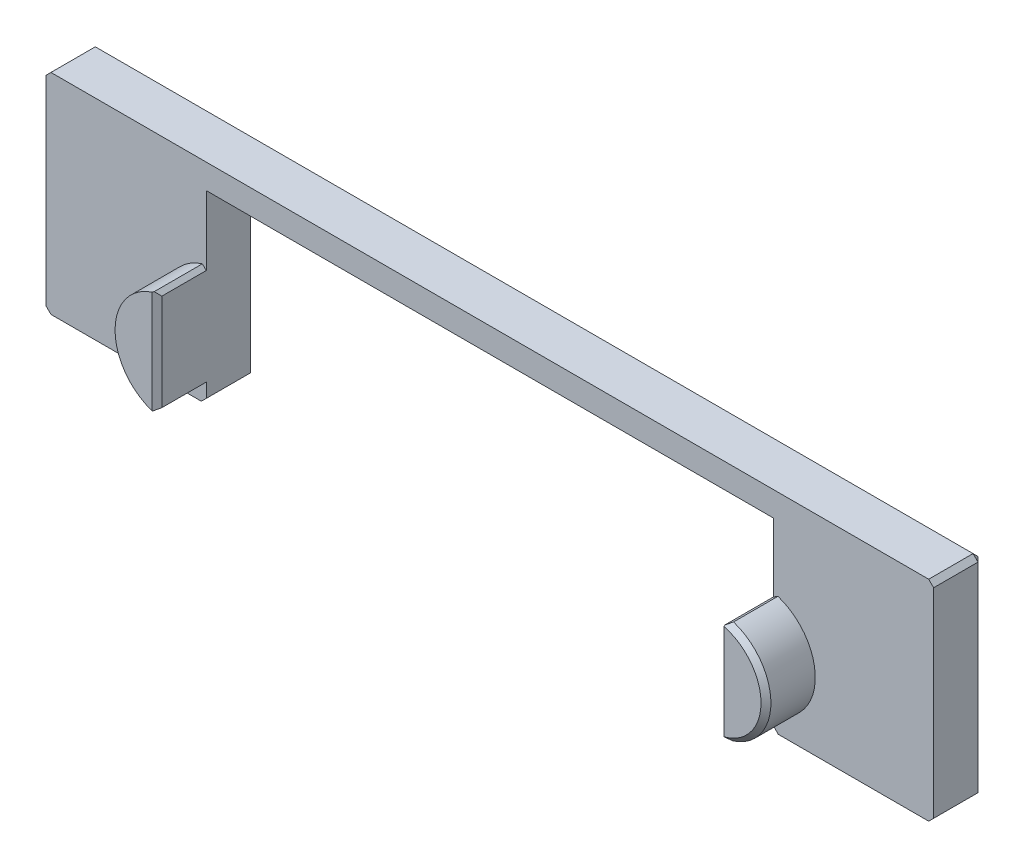
ISO-10303-21;
HEADER;
FILE_DESCRIPTION(('STEP AP214'),'2;1');
FILE_NAME('part.step','',(''),(''),'','','');
FILE_SCHEMA(('AUTOMOTIVE_DESIGN { 1 0 10303 214 1 1 1 1 }'));
ENDSEC;
DATA;
#1=APPLICATION_CONTEXT('core data for automotive mechanical design processes');
#2=APPLICATION_PROTOCOL_DEFINITION('international standard','automotive_design',2000,#1);
#3=PRODUCT_CONTEXT('',#1,'mechanical');
#4=PRODUCT('Part','Part','',(#3));
#5=PRODUCT_RELATED_PRODUCT_CATEGORY('part','',(#4));
#6=PRODUCT_DEFINITION_FORMATION('','',#4);
#7=PRODUCT_DEFINITION_CONTEXT('part definition',#1,'design');
#8=PRODUCT_DEFINITION('design','',#6,#7);
#9=PRODUCT_DEFINITION_SHAPE('','',#8);
#10=(LENGTH_UNIT() NAMED_UNIT(*) SI_UNIT(.MILLI.,.METRE.));
#11=(NAMED_UNIT(*) PLANE_ANGLE_UNIT() SI_UNIT($,.RADIAN.));
#12=(NAMED_UNIT(*) SI_UNIT($,.STERADIAN.) SOLID_ANGLE_UNIT());
#13=UNCERTAINTY_MEASURE_WITH_UNIT(LENGTH_MEASURE(1.E-05),#10,'distance_accuracy_value','');
#14=(GEOMETRIC_REPRESENTATION_CONTEXT(3) GLOBAL_UNCERTAINTY_ASSIGNED_CONTEXT((#13)) GLOBAL_UNIT_ASSIGNED_CONTEXT((#10,
#11,#12)) REPRESENTATION_CONTEXT('',''));
#15=CARTESIAN_POINT('',(0.,0.,0.));
#16=DIRECTION('',(0.,0.,1.));
#17=DIRECTION('',(1.,0.,0.));
#18=AXIS2_PLACEMENT_3D('',#15,#16,#17);
#19=CARTESIAN_POINT('',(-18.,-4.25000000000001,-2.));
#20=DIRECTION('',(-1.,0.,0.));
#21=DIRECTION('',(0.,0.,1.));
#22=AXIS2_PLACEMENT_3D('',#19,#20,#21);
#23=PLANE('',#22);
#24=DIRECTION('',(0.,-1.,0.));
#25=VECTOR('',#24,1.);
#26=CARTESIAN_POINT('',(-18.,-4.25000000000001,-1.8));
#27=LINE('',#26,#25);
#28=CARTESIAN_POINT('',(-18.,4.05000000000002,-1.8));
#29=VERTEX_POINT('',#28);
#30=CARTESIAN_POINT('',(-18.,-4.05000000000001,-1.8));
#31=VERTEX_POINT('',#30);
#32=EDGE_CURVE('E589',#29,#31,#27,.T.);
#33=ORIENTED_EDGE('',*,*,#32,.T.);
#34=DIRECTION('',(0.,0.,1.));
#35=VECTOR('',#34,1.);
#36=CARTESIAN_POINT('',(-18.,-4.05000000000001,-2.));
#37=LINE('',#36,#35);
#38=CARTESIAN_POINT('',(-18.,-4.05000000000001,0.));
#39=VERTEX_POINT('',#38);
#40=EDGE_CURVE('E591',#31,#39,#37,.T.);
#41=ORIENTED_EDGE('',*,*,#40,.T.);
#42=DIRECTION('',(0.,-1.,0.));
#43=VECTOR('',#42,1.);
#44=CARTESIAN_POINT('',(-18.,-4.25000000000001,0.));
#45=LINE('',#44,#43);
#46=CARTESIAN_POINT('',(-18.,4.05000000000002,0.));
#47=VERTEX_POINT('',#46);
#48=EDGE_CURVE('E558',#47,#39,#45,.T.);
#49=ORIENTED_EDGE('',*,*,#48,.F.);
#50=DIRECTION('',(0.,0.,-1.));
#51=VECTOR('',#50,1.);
#52=CARTESIAN_POINT('',(-18.,4.05000000000002,-2.));
#53=LINE('',#52,#51);
#54=EDGE_CURVE('E587',#47,#29,#53,.T.);
#55=ORIENTED_EDGE('',*,*,#54,.T.);
#56=EDGE_LOOP('',(#33,#41,#49,#55));
#57=FACE_BOUND('',#56,.T.);
#58=ADVANCED_FACE('F41',(#57),#23,.T.);
#59=CARTESIAN_POINT('',(-18.,4.25000000000001,-2.));
#60=DIRECTION('',(0.,1.,0.));
#61=DIRECTION('',(0.,0.,1.));
#62=AXIS2_PLACEMENT_3D('',#59,#60,#61);
#63=PLANE('',#62);
#64=DIRECTION('',(-1.,0.,0.));
#65=VECTOR('',#64,1.);
#66=CARTESIAN_POINT('',(-18.,4.25000000000001,-1.8));
#67=LINE('',#66,#65);
#68=CARTESIAN_POINT('',(17.8,4.25000000000001,-1.8));
#69=VERTEX_POINT('',#68);
#70=CARTESIAN_POINT('',(-17.8,4.25000000000001,-1.8));
#71=VERTEX_POINT('',#70);
#72=EDGE_CURVE('E595',#69,#71,#67,.T.);
#73=ORIENTED_EDGE('',*,*,#72,.T.);
#74=DIRECTION('',(0.,0.,1.));
#75=VECTOR('',#74,1.);
#76=CARTESIAN_POINT('',(-17.8,4.25000000000001,-2.));
#77=LINE('',#76,#75);
#78=CARTESIAN_POINT('',(-17.8,4.25000000000001,0.));
#79=VERTEX_POINT('',#78);
#80=EDGE_CURVE('E597',#71,#79,#77,.T.);
#81=ORIENTED_EDGE('',*,*,#80,.T.);
#82=DIRECTION('',(-1.,0.,0.));
#83=VECTOR('',#82,1.);
#84=CARTESIAN_POINT('',(-18.,4.25000000000001,0.));
#85=LINE('',#84,#83);
#86=CARTESIAN_POINT('',(17.8,4.25000000000001,0.));
#87=VERTEX_POINT('',#86);
#88=EDGE_CURVE('E239',#87,#79,#85,.T.);
#89=ORIENTED_EDGE('',*,*,#88,.F.);
#90=DIRECTION('',(0.,0.,-1.));
#91=VECTOR('',#90,1.);
#92=CARTESIAN_POINT('',(17.8,4.25000000000001,-2.));
#93=LINE('',#92,#91);
#94=EDGE_CURVE('E593',#87,#69,#93,.T.);
#95=ORIENTED_EDGE('',*,*,#94,.T.);
#96=EDGE_LOOP('',(#73,#81,#89,#95));
#97=FACE_BOUND('',#96,.T.);
#98=ADVANCED_FACE('F506',(#97),#63,.T.);
#99=CARTESIAN_POINT('',(18.,4.25000000000001,-2.));
#100=DIRECTION('',(1.,0.,0.));
#101=DIRECTION('',(0.,0.,-1.));
#102=AXIS2_PLACEMENT_3D('',#99,#100,#101);
#103=PLANE('',#102);
#104=DIRECTION('',(0.,1.,0.));
#105=VECTOR('',#104,1.);
#106=CARTESIAN_POINT('',(18.,4.25000000000001,-1.8));
#107=LINE('',#106,#105);
#108=CARTESIAN_POINT('',(18.,-4.04999999999999,-1.8));
#109=VERTEX_POINT('',#108);
#110=CARTESIAN_POINT('',(18.,4.05000000000002,-1.8));
#111=VERTEX_POINT('',#110);
#112=EDGE_CURVE('E59',#109,#111,#107,.T.);
#113=ORIENTED_EDGE('',*,*,#112,.T.);
#114=DIRECTION('',(0.,0.,1.));
#115=VECTOR('',#114,1.);
#116=CARTESIAN_POINT('',(18.,4.05000000000002,-2.));
#117=LINE('',#116,#115);
#118=CARTESIAN_POINT('',(18.,4.05000000000002,0.));
#119=VERTEX_POINT('',#118);
#120=EDGE_CURVE('E601',#111,#119,#117,.T.);
#121=ORIENTED_EDGE('',*,*,#120,.T.);
#122=DIRECTION('',(0.,1.,0.));
#123=VECTOR('',#122,1.);
#124=CARTESIAN_POINT('',(18.,4.25000000000001,0.));
#125=LINE('',#124,#123);
#126=CARTESIAN_POINT('',(18.,-4.04999999999999,0.));
#127=VERTEX_POINT('',#126);
#128=EDGE_CURVE('E265',#127,#119,#125,.T.);
#129=ORIENTED_EDGE('',*,*,#128,.F.);
#130=DIRECTION('',(0.,0.,-1.));
#131=VECTOR('',#130,1.);
#132=CARTESIAN_POINT('',(18.,-4.04999999999999,-2.));
#133=LINE('',#132,#131);
#134=EDGE_CURVE('E64',#127,#109,#133,.T.);
#135=ORIENTED_EDGE('',*,*,#134,.T.);
#136=EDGE_LOOP('',(#113,#121,#129,#135));
#137=FACE_BOUND('',#136,.T.);
#138=ADVANCED_FACE('F512',(#137),#103,.T.);
#139=CARTESIAN_POINT('',(18.,-4.24999999999999,-2.));
#140=DIRECTION('',(0.,-1.,0.));
#141=DIRECTION('',(1.,0.,0.));
#142=AXIS2_PLACEMENT_3D('',#139,#140,#141);
#143=PLANE('',#142);
#144=DIRECTION('',(1.,0.,0.));
#145=VECTOR('',#144,1.);
#146=CARTESIAN_POINT('',(18.,-4.24999999999999,0.));
#147=LINE('',#146,#145);
#148=CARTESIAN_POINT('',(11.7,-4.25000000000001,0.));
#149=VERTEX_POINT('',#148);
#150=CARTESIAN_POINT('',(17.8,-4.24999999999999,0.));
#151=VERTEX_POINT('',#150);
#152=EDGE_CURVE('E262',#149,#151,#147,.T.);
#153=ORIENTED_EDGE('',*,*,#152,.F.);
#154=DIRECTION('',(0.,0.,-1.));
#155=VECTOR('',#154,1.);
#156=CARTESIAN_POINT('',(11.7,-4.25000000000001,-2.));
#157=LINE('',#156,#155);
#158=CARTESIAN_POINT('',(11.7,-4.25000000000001,-1.8));
#159=VERTEX_POINT('',#158);
#160=EDGE_CURVE('E585',#149,#159,#157,.T.);
#161=ORIENTED_EDGE('',*,*,#160,.T.);
#162=DIRECTION('',(1.,0.,0.));
#163=VECTOR('',#162,1.);
#164=CARTESIAN_POINT('',(18.,-4.24999999999999,-1.8));
#165=LINE('',#164,#163);
#166=CARTESIAN_POINT('',(17.8,-4.24999999999999,-1.8));
#167=VERTEX_POINT('',#166);
#168=EDGE_CURVE('E583',#159,#167,#165,.T.);
#169=ORIENTED_EDGE('',*,*,#168,.T.);
#170=DIRECTION('',(0.,0.,1.));
#171=VECTOR('',#170,1.);
#172=CARTESIAN_POINT('',(17.8,-4.24999999999999,-2.));
#173=LINE('',#172,#171);
#174=EDGE_CURVE('E577',#167,#151,#173,.T.);
#175=ORIENTED_EDGE('',*,*,#174,.T.);
#176=EDGE_LOOP('',(#153,#161,#169,#175));
#177=FACE_BOUND('',#176,.T.);
#178=ADVANCED_FACE('F768',(#177),#143,.T.);
#179=CARTESIAN_POINT('',(11.5,-4.25000000000001,-2.));
#180=DIRECTION('',(-1.,0.,0.));
#181=DIRECTION('',(0.,0.,1.));
#182=AXIS2_PLACEMENT_3D('',#179,#180,#181);
#183=PLANE('',#182);
#184=DIRECTION('',(0.,-1.,0.));
#185=VECTOR('',#184,1.);
#186=CARTESIAN_POINT('',(11.5,-4.25000000000001,0.));
#187=LINE('',#186,#185);
#188=CARTESIAN_POINT('',(11.5,-3.44242852856285,0.));
#189=VERTEX_POINT('',#188);
#190=CARTESIAN_POINT('',(11.5,-4.05000000000001,0.));
#191=VERTEX_POINT('',#190);
#192=EDGE_CURVE('E255',#189,#191,#187,.T.);
#193=ORIENTED_EDGE('',*,*,#192,.F.);
#194=DIRECTION('',(0.,0.,1.));
#195=VECTOR('',#194,1.);
#196=CARTESIAN_POINT('',(11.5,-3.44242852856285,2.));
#197=LINE('',#196,#195);
#198=CARTESIAN_POINT('',(11.5,-3.44242852856285,1.99425111527518));
#199=VERTEX_POINT('',#198);
#200=EDGE_CURVE('E678',#189,#199,#197,.T.);
#201=ORIENTED_EDGE('',*,*,#200,.T.);
#202=CARTESIAN_POINT('',(11.5,-3.44242852856285,1.99425111527518));
#203=CARTESIAN_POINT('',(11.5,-3.4414390983257,1.99520930989538));
#204=CARTESIAN_POINT('',(11.5,-3.44044964525219,1.99616748093255));
#205=CARTESIAN_POINT('',(11.5,-3.43847069343248,1.99808377584082));
#206=CARTESIAN_POINT('',(11.5,-3.43748119468627,1.99904189971193));
#207=CARTESIAN_POINT('',(11.5,-3.4364916731037,2.));
#208=B_SPLINE_CURVE_WITH_KNOTS('',3,(#202,#203,#204,#205,#206,#207),.UNSPECIFIED.,.F.,.F.,(4,2,
4),(0.,0.00413206753214065,0.0082641350642888),.UNSPECIFIED.);
#209=CARTESIAN_POINT('',(11.5,-3.4364916731037,2.));
#210=VERTEX_POINT('',#209);
#211=EDGE_CURVE('E312',#199,#210,#208,.T.);
#212=ORIENTED_EDGE('',*,*,#211,.T.);
#213=DIRECTION('',(0.,-1.,0.));
#214=VECTOR('',#213,1.);
#215=CARTESIAN_POINT('',(11.5,0.,2.));
#216=LINE('',#215,#214);
#217=CARTESIAN_POINT('',(11.5,0.436491673103699,2.));
#218=VERTEX_POINT('',#217);
#219=EDGE_CURVE('E552',#218,#210,#216,.T.);
#220=ORIENTED_EDGE('',*,*,#219,.F.);
#221=CARTESIAN_POINT('',(11.5,0.436491673103699,2.));
#222=CARTESIAN_POINT('',(11.5,0.443064199806818,1.99363613963068));
#223=CARTESIAN_POINT('',(11.5,0.449635743499461,1.98727126464591));
#224=CARTESIAN_POINT('',(11.5,0.462776864860829,1.97453948544832));
#225=CARTESIAN_POINT('',(11.5,0.469346442529555,1.9681725812355));
#226=CARTESIAN_POINT('',(11.5,0.475915037187806,1.96180466240723));
#227=B_SPLINE_CURVE_WITH_KNOTS('',3,(#221,#222,#223,#224,#225,#226),.UNSPECIFIED.,.F.,.F.,(4,2,
4),(0.,0.027445789853547,0.054891579694714),.UNSPECIFIED.);
#228=CARTESIAN_POINT('',(11.5,0.475915037187806,1.96180466240723));
#229=VERTEX_POINT('',#228);
#230=EDGE_CURVE('E304',#218,#229,#227,.T.);
#231=ORIENTED_EDGE('',*,*,#230,.T.);
#232=DIRECTION('',(0.,0.,-1.));
#233=VECTOR('',#232,1.);
#234=CARTESIAN_POINT('',(11.5,0.475915037187806,0.));
#235=LINE('',#234,#233);
#236=CARTESIAN_POINT('',(11.5,0.475915037187806,0.));
#237=VERTEX_POINT('',#236);
#238=EDGE_CURVE('E301',#229,#237,#235,.T.);
#239=ORIENTED_EDGE('',*,*,#238,.T.);
#240=CARTESIAN_POINT('',(11.5,3.25,0.));
#241=VERTEX_POINT('',#240);
#242=EDGE_CURVE('E258',#241,#237,#187,.T.);
#243=ORIENTED_EDGE('',*,*,#242,.F.);
#244=DIRECTION('',(0.,0.,1.));
#245=VECTOR('',#244,1.);
#246=CARTESIAN_POINT('',(11.5,3.25,-2.));
#247=LINE('',#246,#245);
#248=CARTESIAN_POINT('',(11.5,3.25,-1.8));
#249=VERTEX_POINT('',#248);
#250=EDGE_CURVE('E238',#249,#241,#247,.T.);
#251=ORIENTED_EDGE('',*,*,#250,.F.);
#252=DIRECTION('',(0.,-1.,0.));
#253=VECTOR('',#252,1.);
#254=CARTESIAN_POINT('',(11.5,-4.25000000000001,-1.8));
#255=LINE('',#254,#253);
#256=CARTESIAN_POINT('',(11.5,-4.05000000000001,-1.8));
#257=VERTEX_POINT('',#256);
#258=EDGE_CURVE('E299',#249,#257,#255,.T.);
#259=ORIENTED_EDGE('',*,*,#258,.T.);
#260=DIRECTION('',(0.,0.,1.));
#261=VECTOR('',#260,1.);
#262=CARTESIAN_POINT('',(11.5,-4.05000000000001,-2.));
#263=LINE('',#262,#261);
#264=EDGE_CURVE('E297',#257,#191,#263,.T.);
#265=ORIENTED_EDGE('',*,*,#264,.T.);
#266=EDGE_LOOP('',(#193,#201,#212,#220,#231,#239,#243,#251,#259,#265));
#267=FACE_BOUND('',#266,.T.);
#268=ADVANCED_FACE('F318',(#267),#183,.T.);
#269=CARTESIAN_POINT('',(11.5,3.25,-2.));
#270=DIRECTION('',(0.,-1.,0.));
#271=DIRECTION('',(0.,0.,-1.));
#272=AXIS2_PLACEMENT_3D('',#269,#270,#271);
#273=PLANE('',#272);
#274=DIRECTION('',(0.,0.,1.));
#275=VECTOR('',#274,1.);
#276=CARTESIAN_POINT('',(-11.5,3.25,-2.));
#277=LINE('',#276,#275);
#278=CARTESIAN_POINT('',(-11.5,3.25,-1.8));
#279=VERTEX_POINT('',#278);
#280=CARTESIAN_POINT('',(-11.5,3.25,0.));
#281=VERTEX_POINT('',#280);
#282=EDGE_CURVE('E228',#279,#281,#277,.T.);
#283=ORIENTED_EDGE('',*,*,#282,.F.);
#284=DIRECTION('',(1.,0.,0.));
#285=VECTOR('',#284,1.);
#286=CARTESIAN_POINT('',(11.5,3.25,-1.8));
#287=LINE('',#286,#285);
#288=EDGE_CURVE('E574',#279,#249,#287,.T.);
#289=ORIENTED_EDGE('',*,*,#288,.T.);
#290=ORIENTED_EDGE('',*,*,#250,.T.);
#291=DIRECTION('',(1.,0.,0.));
#292=VECTOR('',#291,1.);
#293=CARTESIAN_POINT('',(11.5,3.25,0.));
#294=LINE('',#293,#292);
#295=EDGE_CURVE('E245',#281,#241,#294,.T.);
#296=ORIENTED_EDGE('',*,*,#295,.F.);
#297=EDGE_LOOP('',(#283,#289,#290,#296));
#298=FACE_BOUND('',#297,.T.);
#299=ADVANCED_FACE('F252',(#298),#273,.T.);
#300=CARTESIAN_POINT('',(-11.5,3.25,-2.));
#301=DIRECTION('',(1.,0.,0.));
#302=DIRECTION('',(0.,1.,0.));
#303=AXIS2_PLACEMENT_3D('',#300,#301,#302);
#304=PLANE('',#303);
#305=DIRECTION('',(0.,0.,-1.));
#306=VECTOR('',#305,1.);
#307=CARTESIAN_POINT('',(-11.5,-3.47591503718783,-2.));
#308=LINE('',#307,#306);
#309=CARTESIAN_POINT('',(-11.5,-3.47591503718783,1.80000000000004));
#310=VERTEX_POINT('',#309);
#311=CARTESIAN_POINT('',(-11.5,-3.47591503718783,0.));
#312=VERTEX_POINT('',#311);
#313=EDGE_CURVE('E278',#310,#312,#308,.T.);
#314=ORIENTED_EDGE('',*,*,#313,.T.);
#315=DIRECTION('',(0.,1.,0.));
#316=VECTOR('',#315,1.);
#317=CARTESIAN_POINT('',(-11.5,3.25,0.));
#318=LINE('',#317,#316);
#319=CARTESIAN_POINT('',(-11.5,-4.05000000000001,0.));
#320=VERTEX_POINT('',#319);
#321=EDGE_CURVE('E249',#320,#312,#318,.T.);
#322=ORIENTED_EDGE('',*,*,#321,.F.);
#323=DIRECTION('',(0.,0.,-1.));
#324=VECTOR('',#323,1.);
#325=CARTESIAN_POINT('',(-11.5,-4.05000000000001,-2.));
#326=LINE('',#325,#324);
#327=CARTESIAN_POINT('',(-11.5,-4.05000000000001,-1.8));
#328=VERTEX_POINT('',#327);
#329=EDGE_CURVE('E272',#320,#328,#326,.T.);
#330=ORIENTED_EDGE('',*,*,#329,.T.);
#331=DIRECTION('',(0.,1.,0.));
#332=VECTOR('',#331,1.);
#333=CARTESIAN_POINT('',(-11.5,3.25,-1.8));
#334=LINE('',#333,#332);
#335=EDGE_CURVE('E234',#328,#279,#334,.T.);
#336=ORIENTED_EDGE('',*,*,#335,.T.);
#337=ORIENTED_EDGE('',*,*,#282,.T.);
#338=CARTESIAN_POINT('',(-11.5,0.442428528562881,0.));
#339=VERTEX_POINT('',#338);
#340=EDGE_CURVE('E232',#339,#281,#318,.T.);
#341=ORIENTED_EDGE('',*,*,#340,.F.);
#342=DIRECTION('',(0.,0.,1.));
#343=VECTOR('',#342,1.);
#344=CARTESIAN_POINT('',(-11.5,0.442428528562881,-2.));
#345=LINE('',#344,#343);
#346=CARTESIAN_POINT('',(-11.5,0.442428528562881,1.80000000000004));
#347=VERTEX_POINT('',#346);
#348=EDGE_CURVE('E274',#339,#347,#345,.T.);
#349=ORIENTED_EDGE('',*,*,#348,.T.);
#350=DIRECTION('',(0.,-1.,0.));
#351=VECTOR('',#350,1.);
#352=CARTESIAN_POINT('',(-11.5,3.25,1.80000000000004));
#353=LINE('',#352,#351);
#354=EDGE_CURVE('E276',#347,#310,#353,.T.);
#355=ORIENTED_EDGE('',*,*,#354,.T.);
#356=EDGE_LOOP('',(#314,#322,#330,#336,#337,#341,#349,#355));
#357=FACE_BOUND('',#356,.T.);
#358=ADVANCED_FACE('F231',(#357),#304,.T.);
#359=CARTESIAN_POINT('',(-11.5,-4.25000000000001,-2.));
#360=DIRECTION('',(0.,-1.,0.));
#361=DIRECTION('',(1.,0.,0.));
#362=AXIS2_PLACEMENT_3D('',#359,#360,#361);
#363=PLANE('',#362);
#364=DIRECTION('',(1.,0.,0.));
#365=VECTOR('',#364,1.);
#366=CARTESIAN_POINT('',(-11.5,-4.25000000000001,-1.8));
#367=LINE('',#366,#365);
#368=CARTESIAN_POINT('',(-17.8,-4.25000000000001,-1.8));
#369=VERTEX_POINT('',#368);
#370=CARTESIAN_POINT('',(-11.7000000000001,-4.25000000000001,-1.8));
#371=VERTEX_POINT('',#370);
#372=EDGE_CURVE('E690',#369,#371,#367,.T.);
#373=ORIENTED_EDGE('',*,*,#372,.T.);
#374=DIRECTION('',(0.,0.,1.));
#375=VECTOR('',#374,1.);
#376=CARTESIAN_POINT('',(-11.7000000000001,-4.25000000000001,-2.));
#377=LINE('',#376,#375);
#378=CARTESIAN_POINT('',(-11.7000000000001,-4.25000000000001,0.));
#379=VERTEX_POINT('',#378);
#380=EDGE_CURVE('E572',#371,#379,#377,.T.);
#381=ORIENTED_EDGE('',*,*,#380,.T.);
#382=DIRECTION('',(1.,0.,0.));
#383=VECTOR('',#382,1.);
#384=CARTESIAN_POINT('',(-11.5,-4.25000000000001,0.));
#385=LINE('',#384,#383);
#386=CARTESIAN_POINT('',(-17.8,-4.25000000000001,0.));
#387=VERTEX_POINT('',#386);
#388=EDGE_CURVE('E250',#387,#379,#385,.T.);
#389=ORIENTED_EDGE('',*,*,#388,.F.);
#390=DIRECTION('',(0.,0.,-1.));
#391=VECTOR('',#390,1.);
#392=CARTESIAN_POINT('',(-17.8,-4.25000000000001,-2.));
#393=LINE('',#392,#391);
#394=EDGE_CURVE('E686',#387,#369,#393,.T.);
#395=ORIENTED_EDGE('',*,*,#394,.T.);
#396=EDGE_LOOP('',(#373,#381,#389,#395));
#397=FACE_BOUND('',#396,.T.);
#398=ADVANCED_FACE('F517',(#397),#363,.T.);
#399=CARTESIAN_POINT('',(0.,0.,-2.));
#400=DIRECTION('',(0.,0.,-1.));
#401=DIRECTION('',(-1.,0.,0.));
#402=AXIS2_PLACEMENT_3D('',#399,#400,#401);
#403=PLANE('',#402);
#404=DIRECTION('',(0.,-1.,0.));
#405=VECTOR('',#404,1.);
#406=CARTESIAN_POINT('',(-11.7,0.,-2.));
#407=LINE('',#406,#405);
#408=CARTESIAN_POINT('',(-11.7,3.45,-2.));
#409=VERTEX_POINT('',#408);
#410=CARTESIAN_POINT('',(-11.7,-4.05000000000001,-2.));
#411=VERTEX_POINT('',#410);
#412=EDGE_CURVE('E705',#409,#411,#407,.T.);
#413=ORIENTED_EDGE('',*,*,#412,.T.);
#414=DIRECTION('',(-1.,0.,0.));
#415=VECTOR('',#414,1.);
#416=CARTESIAN_POINT('',(0.,-4.05000000000001,-2.));
#417=LINE('',#416,#415);
#418=CARTESIAN_POINT('',(-17.8,-4.05000000000001,-2.));
#419=VERTEX_POINT('',#418);
#420=EDGE_CURVE('E707',#411,#419,#417,.T.);
#421=ORIENTED_EDGE('',*,*,#420,.T.);
#422=DIRECTION('',(0.,1.,0.));
#423=VECTOR('',#422,1.);
#424=CARTESIAN_POINT('',(-17.8,0.,-2.));
#425=LINE('',#424,#423);
#426=CARTESIAN_POINT('',(-17.8,4.05000000000002,-2.));
#427=VERTEX_POINT('',#426);
#428=EDGE_CURVE('E697',#419,#427,#425,.T.);
#429=ORIENTED_EDGE('',*,*,#428,.T.);
#430=DIRECTION('',(1.,0.,0.));
#431=VECTOR('',#430,1.);
#432=CARTESIAN_POINT('',(0.,4.05000000000002,-2.));
#433=LINE('',#432,#431);
#434=CARTESIAN_POINT('',(17.8,4.05000000000002,-2.));
#435=VERTEX_POINT('',#434);
#436=EDGE_CURVE('E695',#427,#435,#433,.T.);
#437=ORIENTED_EDGE('',*,*,#436,.T.);
#438=DIRECTION('',(0.,-1.,0.));
#439=VECTOR('',#438,1.);
#440=CARTESIAN_POINT('',(17.8,0.,-2.));
#441=LINE('',#440,#439);
#442=CARTESIAN_POINT('',(17.8,-4.05,-2.));
#443=VERTEX_POINT('',#442);
#444=EDGE_CURVE('E693',#435,#443,#441,.T.);
#445=ORIENTED_EDGE('',*,*,#444,.T.);
#446=DIRECTION('',(-1.,0.,0.));
#447=VECTOR('',#446,1.);
#448=CARTESIAN_POINT('',(0.,-4.05000000000004,-2.));
#449=LINE('',#448,#447);
#450=CARTESIAN_POINT('',(11.7,-4.05000000000001,-2.));
#451=VERTEX_POINT('',#450);
#452=EDGE_CURVE('E699',#443,#451,#449,.T.);
#453=ORIENTED_EDGE('',*,*,#452,.T.);
#454=DIRECTION('',(0.,1.,0.));
#455=VECTOR('',#454,1.);
#456=CARTESIAN_POINT('',(11.7,0.,-2.));
#457=LINE('',#456,#455);
#458=CARTESIAN_POINT('',(11.7,3.45,-2.));
#459=VERTEX_POINT('',#458);
#460=EDGE_CURVE('E701',#451,#459,#457,.T.);
#461=ORIENTED_EDGE('',*,*,#460,.T.);
#462=DIRECTION('',(-1.,0.,0.));
#463=VECTOR('',#462,1.);
#464=CARTESIAN_POINT('',(0.,3.45,-2.));
#465=LINE('',#464,#463);
#466=EDGE_CURVE('E703',#459,#409,#465,.T.);
#467=ORIENTED_EDGE('',*,*,#466,.T.);
#468=EDGE_LOOP('',(#413,#421,#429,#437,#445,#453,#461,#467));
#469=FACE_BOUND('',#468,.T.);
#470=ADVANCED_FACE('F731',(#469),#403,.T.);
#471=CARTESIAN_POINT('',(0.,0.,0.));
#472=DIRECTION('',(0.,0.,-1.));
#473=DIRECTION('',(-1.,0.,0.));
#474=AXIS2_PLACEMENT_3D('',#471,#472,#473);
#475=PLANE('',#474);
#476=ORIENTED_EDGE('',*,*,#388,.T.);
#477=DIRECTION('',(-0.707106781186554,-0.707106781186541,0.));
#478=VECTOR('',#477,1.);
#479=CARTESIAN_POINT('',(-11.7000000000001,-4.25000000000001,0.));
#480=LINE('',#479,#478);
#481=EDGE_CURVE('E563',#379,#320,#480,.F.);
#482=ORIENTED_EDGE('',*,*,#481,.T.);
#483=ORIENTED_EDGE('',*,*,#321,.T.);
#484=DIRECTION('',(0.849308696067092,0.52789652280046,0.));
#485=VECTOR('',#484,1.);
#486=CARTESIAN_POINT('',(-1.64634304340196,2.64872641337585,0.));
#487=LINE('',#486,#485);
#488=CARTESIAN_POINT('',(-11.6847220332705,-3.59073090979063,0.));
#489=VERTEX_POINT('',#488);
#490=EDGE_CURVE('E603',#312,#489,#487,.F.);
#491=ORIENTED_EDGE('',*,*,#490,.T.);
#492=CARTESIAN_POINT('',(-11.,-1.5,0.));
#493=DIRECTION('',(0.,0.,-1.));
#494=DIRECTION('',(-1.,0.,0.));
#495=AXIS2_PLACEMENT_3D('',#492,#493,#494);
#496=CIRCLE('',#495,2.2);
#497=CARTESIAN_POINT('',(-11.6571361936925,0.599564722255368,0.));
#498=VERTEX_POINT('',#497);
#499=EDGE_CURVE('E549',#489,#498,#496,.T.);
#500=ORIENTED_EDGE('',*,*,#499,.T.);
#501=DIRECTION('',(-0.707106781186552,0.707106781186543,0.));
#502=VECTOR('',#501,1.);
#503=CARTESIAN_POINT('',(-5.52878573571851,-5.52878573571858,0.));
#504=LINE('',#503,#502);
#505=EDGE_CURVE('E11',#498,#339,#504,.F.);
#506=ORIENTED_EDGE('',*,*,#505,.T.);
#507=ORIENTED_EDGE('',*,*,#340,.T.);
#508=ORIENTED_EDGE('',*,*,#295,.T.);
#509=ORIENTED_EDGE('',*,*,#242,.T.);
#510=DIRECTION('',(-0.849308696067093,-0.527896522800458,0.));
#511=VECTOR('',#510,1.);
#512=CARTESIAN_POINT('',(2.99138436571596,-4.81270219702138,0.));
#513=LINE('',#512,#511);
#514=CARTESIAN_POINT('',(11.6847220332705,0.590730909790623,0.));
#515=VERTEX_POINT('',#514);
#516=EDGE_CURVE('E51',#237,#515,#513,.F.);
#517=ORIENTED_EDGE('',*,*,#516,.T.);
#518=CARTESIAN_POINT('',(11.,-1.5,0.));
#519=DIRECTION('',(0.,0.,1.));
#520=DIRECTION('',(1.,0.,0.));
#521=AXIS2_PLACEMENT_3D('',#518,#519,#520);
#522=CIRCLE('',#521,2.2);
#523=CARTESIAN_POINT('',(11.6571361936925,-3.59956472225537,0.));
#524=VERTEX_POINT('',#523);
#525=EDGE_CURVE('E548',#524,#515,#522,.T.);
#526=ORIENTED_EDGE('',*,*,#525,.F.);
#527=DIRECTION('',(0.707106781186549,-0.707106781186547,0.));
#528=VECTOR('',#527,1.);
#529=CARTESIAN_POINT('',(4.02878573571857,4.02878573571858,0.));
#530=LINE('',#529,#528);
#531=EDGE_CURVE('E605',#524,#189,#530,.F.);
#532=ORIENTED_EDGE('',*,*,#531,.T.);
#533=ORIENTED_EDGE('',*,*,#192,.T.);
#534=DIRECTION('',(-0.707106781186554,0.707106781186541,0.));
#535=VECTOR('',#534,1.);
#536=CARTESIAN_POINT('',(11.5,-4.05000000000001,0.));
#537=LINE('',#536,#535);
#538=EDGE_CURVE('E575',#191,#149,#537,.F.);
#539=ORIENTED_EDGE('',*,*,#538,.T.);
#540=ORIENTED_EDGE('',*,*,#152,.T.);
#541=DIRECTION('',(-0.707106781186554,-0.707106781186541,0.));
#542=VECTOR('',#541,1.);
#543=CARTESIAN_POINT('',(17.8,-4.24999999999999,0.));
#544=LINE('',#543,#542);
#545=EDGE_CURVE('E710',#151,#127,#544,.F.);
#546=ORIENTED_EDGE('',*,*,#545,.T.);
#547=ORIENTED_EDGE('',*,*,#128,.T.);
#548=DIRECTION('',(0.707106781186548,-0.707106781186548,0.));
#549=VECTOR('',#548,1.);
#550=CARTESIAN_POINT('',(18.,4.05000000000002,0.));
#551=LINE('',#550,#549);
#552=EDGE_CURVE('E712',#119,#87,#551,.F.);
#553=ORIENTED_EDGE('',*,*,#552,.T.);
#554=ORIENTED_EDGE('',*,*,#88,.T.);
#555=DIRECTION('',(0.707106781186554,0.707106781186541,0.));
#556=VECTOR('',#555,1.);
#557=CARTESIAN_POINT('',(-17.8,4.25000000000001,0.));
#558=LINE('',#557,#556);
#559=EDGE_CURVE('E714',#79,#47,#558,.F.);
#560=ORIENTED_EDGE('',*,*,#559,.T.);
#561=ORIENTED_EDGE('',*,*,#48,.T.);
#562=DIRECTION('',(-0.707106781186541,0.707106781186554,0.));
#563=VECTOR('',#562,1.);
#564=CARTESIAN_POINT('',(-18.,-4.05000000000001,0.));
#565=LINE('',#564,#563);
#566=EDGE_CURVE('E566',#39,#387,#565,.F.);
#567=ORIENTED_EDGE('',*,*,#566,.T.);
#568=EDGE_LOOP('',(#476,#482,#483,#491,#500,#506,#507,#508,#509,#517,#526,#532,#533,#539,#540,
#546,#547,#553,#554,#560,#561,#567));
#569=FACE_BOUND('',#568,.T.);
#570=ADVANCED_FACE('F244',(#569),#475,.F.);
#571=CARTESIAN_POINT('',(11.,-1.5,2.));
#572=DIRECTION('',(0.,0.,-1.));
#573=DIRECTION('',(-1.,0.,0.));
#574=AXIS2_PLACEMENT_3D('',#571,#572,#573);
#575=CYLINDRICAL_SURFACE('',#574,2.2);
#576=CARTESIAN_POINT('',(11.,-1.5,1.8));
#577=DIRECTION('',(0.,0.,1.));
#578=DIRECTION('',(1.,0.,0.));
#579=AXIS2_PLACEMENT_3D('',#576,#577,#578);
#580=CIRCLE('',#579,2.2);
#581=CARTESIAN_POINT('',(11.6847220332705,0.590730909790623,1.8));
#582=VERTEX_POINT('',#581);
#583=CARTESIAN_POINT('',(11.6571361936925,-3.59956472225537,1.8));
#584=VERTEX_POINT('',#583);
#585=EDGE_CURVE('E292',#582,#584,#580,.F.);
#586=ORIENTED_EDGE('',*,*,#585,.T.);
#587=DIRECTION('',(0.,0.,-1.));
#588=VECTOR('',#587,1.);
#589=CARTESIAN_POINT('',(11.6571361936925,-3.59956472225537,2.));
#590=LINE('',#589,#588);
#591=EDGE_CURVE('E294',#584,#524,#590,.T.);
#592=ORIENTED_EDGE('',*,*,#591,.T.);
#593=ORIENTED_EDGE('',*,*,#525,.T.);
#594=DIRECTION('',(0.,0.,-1.));
#595=VECTOR('',#594,1.);
#596=CARTESIAN_POINT('',(11.6847220332705,0.590730909790623,2.));
#597=LINE('',#596,#595);
#598=EDGE_CURVE('E290',#515,#582,#597,.F.);
#599=ORIENTED_EDGE('',*,*,#598,.T.);
#600=EDGE_LOOP('',(#586,#592,#593,#599));
#601=FACE_BOUND('',#600,.T.);
#602=ADVANCED_FACE('F746',(#601),#575,.T.);
#603=CARTESIAN_POINT('',(0.,0.,2.));
#604=DIRECTION('',(0.,0.,1.));
#605=DIRECTION('',(1.,0.,0.));
#606=AXIS2_PLACEMENT_3D('',#603,#604,#605);
#607=PLANE('',#606);
#608=ORIENTED_EDGE('',*,*,#219,.T.);
#609=CARTESIAN_POINT('',(11.,-1.5,2.));
#610=DIRECTION('',(0.,0.,1.));
#611=DIRECTION('',(1.,0.,0.));
#612=AXIS2_PLACEMENT_3D('',#609,#610,#611);
#613=CIRCLE('',#612,2.);
#614=EDGE_CURVE('E683',#210,#218,#613,.T.);
#615=ORIENTED_EDGE('',*,*,#614,.T.);
#616=EDGE_LOOP('',(#608,#615));
#617=FACE_BOUND('',#616,.T.);
#618=ADVANCED_FACE('F752',(#617),#607,.T.);
#619=CARTESIAN_POINT('',(-11.,-1.5,2.));
#620=DIRECTION('',(0.,0.,-1.));
#621=DIRECTION('',(-1.,0.,0.));
#622=AXIS2_PLACEMENT_3D('',#619,#620,#621);
#623=CYLINDRICAL_SURFACE('',#622,2.2);
#624=ORIENTED_EDGE('',*,*,#499,.F.);
#625=DIRECTION('',(0.,0.,-1.));
#626=VECTOR('',#625,1.);
#627=CARTESIAN_POINT('',(-11.6847220332705,-3.59073090979063,2.));
#628=LINE('',#627,#626);
#629=CARTESIAN_POINT('',(-11.6847220332705,-3.59073090979063,1.98472203327045));
#630=VERTEX_POINT('',#629);
#631=EDGE_CURVE('E286',#489,#630,#628,.F.);
#632=ORIENTED_EDGE('',*,*,#631,.T.);
#633=CARTESIAN_POINT('',(-11.,-1.5,1.29999999999999));
#634=DIRECTION('',(-0.70710678118654,0.,-0.707106781186555));
#635=DIRECTION('',(0.707106781186555,0.,-0.70710678118654));
#636=AXIS2_PLACEMENT_3D('',#633,#634,#635);
#637=ELLIPSE('',#636,3.11126983722077,2.2);
#638=CARTESIAN_POINT('',(-11.7,-3.58566536146141,2.));
#639=VERTEX_POINT('',#638);
#640=EDGE_CURVE('E284',#630,#639,#637,.T.);
#641=ORIENTED_EDGE('',*,*,#640,.T.);
#642=CARTESIAN_POINT('',(-11.,-1.5,2.));
#643=DIRECTION('',(0.,0.,-1.));
#644=DIRECTION('',(-1.,0.,0.));
#645=AXIS2_PLACEMENT_3D('',#642,#643,#644);
#646=CIRCLE('',#645,2.2);
#647=CARTESIAN_POINT('',(-11.7,0.58566536146141,2.));
#648=VERTEX_POINT('',#647);
#649=EDGE_CURVE('E543',#639,#648,#646,.T.);
#650=ORIENTED_EDGE('',*,*,#649,.T.);
#651=CARTESIAN_POINT('',(-11.,-1.5,1.29999999999999));
#652=DIRECTION('',(-0.70710678118654,0.,-0.707106781186555));
#653=DIRECTION('',(0.707106781186555,0.,-0.70710678118654));
#654=AXIS2_PLACEMENT_3D('',#651,#652,#653);
#655=ELLIPSE('',#654,3.11126983722077,2.2);
#656=CARTESIAN_POINT('',(-11.6571361936925,0.599564722255368,1.95713619369252));
#657=VERTEX_POINT('',#656);
#658=EDGE_CURVE('E282',#648,#657,#655,.T.);
#659=ORIENTED_EDGE('',*,*,#658,.T.);
#660=DIRECTION('',(0.,0.,-1.));
#661=VECTOR('',#660,1.);
#662=CARTESIAN_POINT('',(-11.6571361936925,0.599564722255368,2.));
#663=LINE('',#662,#661);
#664=EDGE_CURVE('E280',#657,#498,#663,.T.);
#665=ORIENTED_EDGE('',*,*,#664,.T.);
#666=EDGE_LOOP('',(#624,#632,#641,#650,#659,#665));
#667=FACE_BOUND('',#666,.T.);
#668=ADVANCED_FACE('F546',(#667),#623,.T.);
#669=CARTESIAN_POINT('',(0.,0.,2.));
#670=DIRECTION('',(0.,0.,1.));
#671=DIRECTION('',(-1.,0.,0.));
#672=AXIS2_PLACEMENT_3D('',#669,#670,#671);
#673=PLANE('',#672);
#674=ORIENTED_EDGE('',*,*,#649,.F.);
#675=DIRECTION('',(0.,1.,0.));
#676=VECTOR('',#675,1.);
#677=CARTESIAN_POINT('',(-11.7,0.,2.));
#678=LINE('',#677,#676);
#679=EDGE_CURVE('E288',#639,#648,#678,.T.);
#680=ORIENTED_EDGE('',*,*,#679,.T.);
#681=EDGE_LOOP('',(#674,#680));
#682=FACE_BOUND('',#681,.T.);
#683=ADVANCED_FACE('F532',(#682),#673,.T.);
#684=CARTESIAN_POINT('',(-11.6571361936925,0.599564722255368,2.));
#685=DIRECTION('',(-0.707106781186543,-0.707106781186552,0.));
#686=DIRECTION('',(0.,0.,-1.));
#687=AXIS2_PLACEMENT_3D('',#684,#685,#686);
#688=PLANE('',#687);
#689=ORIENTED_EDGE('',*,*,#505,.F.);
#690=ORIENTED_EDGE('',*,*,#664,.F.);
#691=DIRECTION('',(0.577350269189632,-0.577350269189625,-0.57735026918962));
#692=VECTOR('',#691,1.);
#693=CARTESIAN_POINT('',(-11.6714241291284,0.613852657691194,1.97142412912835));
#694=LINE('',#693,#692);
#695=EDGE_CURVE('E554',#347,#657,#694,.F.);
#696=ORIENTED_EDGE('',*,*,#695,.F.);
#697=ORIENTED_EDGE('',*,*,#348,.F.);
#698=EDGE_LOOP('',(#689,#690,#696,#697));
#699=FACE_BOUND('',#698,.T.);
#700=ADVANCED_FACE('F335',(#699),#688,.F.);
#701=CARTESIAN_POINT('',(-11.5,3.25,1.80000000000004));
#702=DIRECTION('',(-0.70710678118654,0.,-0.707106781186555));
#703=DIRECTION('',(0.,-1.,0.));
#704=AXIS2_PLACEMENT_3D('',#701,#702,#703);
#705=PLANE('',#704);
#706=ORIENTED_EDGE('',*,*,#679,.F.);
#707=ORIENTED_EDGE('',*,*,#640,.F.);
#708=DIRECTION('',(0.647342468711746,0.40236234466508,-0.647342468711733));
#709=VECTOR('',#708,1.);
#710=CARTESIAN_POINT('',(-9.74812624334107,-2.38701995250522,0.0481262433410978));
#711=LINE('',#710,#709);
#712=EDGE_CURVE('E357',#310,#630,#711,.F.);
#713=ORIENTED_EDGE('',*,*,#712,.F.);
#714=ORIENTED_EDGE('',*,*,#354,.F.);
#715=ORIENTED_EDGE('',*,*,#695,.T.);
#716=ORIENTED_EDGE('',*,*,#658,.F.);
#717=EDGE_LOOP('',(#706,#707,#713,#714,#715,#716));
#718=FACE_BOUND('',#717,.T.);
#719=ADVANCED_FACE('F523',(#718),#705,.F.);
#720=CARTESIAN_POINT('',(-11.5,-3.47591503718783,2.));
#721=DIRECTION('',(-0.52789652280046,0.849308696067092,0.));
#722=DIRECTION('',(0.,0.,-1.));
#723=AXIS2_PLACEMENT_3D('',#720,#721,#722);
#724=PLANE('',#723);
#725=ORIENTED_EDGE('',*,*,#712,.T.);
#726=ORIENTED_EDGE('',*,*,#631,.F.);
#727=ORIENTED_EDGE('',*,*,#490,.F.);
#728=ORIENTED_EDGE('',*,*,#313,.F.);
#729=EDGE_LOOP('',(#725,#726,#727,#728));
#730=FACE_BOUND('',#729,.T.);
#731=ADVANCED_FACE('F367',(#730),#724,.F.);
#732=CARTESIAN_POINT('',(11.5,0.475915037187806,2.));
#733=DIRECTION('',(0.527896522800458,-0.849308696067093,0.));
#734=DIRECTION('',(0.,0.,-1.));
#735=AXIS2_PLACEMENT_3D('',#732,#733,#734);
#736=PLANE('',#735);
#737=ORIENTED_EDGE('',*,*,#516,.F.);
#738=ORIENTED_EDGE('',*,*,#238,.F.);
#739=CARTESIAN_POINT('',(11.5,0.475915037187806,1.96180466240723));
#740=CARTESIAN_POINT('',(11.531124962345,0.495261076466905,1.93537194300187));
#741=CARTESIAN_POINT('',(11.5620809779333,0.514502105158221,1.90867183285111));
#742=CARTESIAN_POINT('',(11.6236549876188,0.552774061819466,1.85473694315903));
#743=CARTESIAN_POINT('',(11.6542729831207,0.571804990662423,1.82750216584072));
#744=CARTESIAN_POINT('',(11.6847220332705,0.590730909790624,1.80000000000001));
#745=B_SPLINE_CURVE_WITH_KNOTS('',3,(#739,#740,#741,#742,#743,#744),.UNSPECIFIED.,.F.,.F.,(4,2,
4),(0.,0.135545164850614,0.271089766258451),.UNSPECIFIED.);
#746=EDGE_CURVE('E350',#582,#229,#745,.F.);
#747=ORIENTED_EDGE('',*,*,#746,.F.);
#748=ORIENTED_EDGE('',*,*,#598,.F.);
#749=EDGE_LOOP('',(#737,#738,#747,#748));
#750=FACE_BOUND('',#749,.T.);
#751=ADVANCED_FACE('F332',(#750),#736,.F.);
#752=CARTESIAN_POINT('',(11.,-1.5,2.));
#753=DIRECTION('',(0.,0.,-1.));
#754=DIRECTION('',(-1.,0.,0.));
#755=AXIS2_PLACEMENT_3D('',#752,#753,#754);
#756=CONICAL_SURFACE('',#755,2.,0.785398163397459);
#757=ORIENTED_EDGE('',*,*,#614,.F.);
#758=ORIENTED_EDGE('',*,*,#211,.F.);
#759=CARTESIAN_POINT('',(11.5,-3.44242852856285,1.99425111527518));
#760=CARTESIAN_POINT('',(11.5263511425924,-3.46877967115528,1.96213761985237));
#761=CARTESIAN_POINT('',(11.5526214042016,-3.49504993276441,1.92989326979033));
#762=CARTESIAN_POINT('',(11.6050001352458,-3.54742866380868,1.86514289773008));
#763=CARTESIAN_POINT('',(11.6311086048676,-3.57353713343038,1.83263687603372));
#764=CARTESIAN_POINT('',(11.6571361936925,-3.59956472225537,1.8));
#765=B_SPLINE_CURVE_WITH_KNOTS('',3,(#759,#760,#761,#762,#763,#764),.UNSPECIFIED.,.F.,.F.,(4,2,
4),(0.,0.147579004633237,0.295157839045514),.UNSPECIFIED.);
#766=EDGE_CURVE('E342',#584,#199,#765,.F.);
#767=ORIENTED_EDGE('',*,*,#766,.F.);
#768=ORIENTED_EDGE('',*,*,#585,.F.);
#769=ORIENTED_EDGE('',*,*,#746,.T.);
#770=ORIENTED_EDGE('',*,*,#230,.F.);
#771=EDGE_LOOP('',(#757,#758,#767,#768,#769,#770));
#772=FACE_BOUND('',#771,.T.);
#773=ADVANCED_FACE('F323',(#772),#756,.T.);
#774=CARTESIAN_POINT('',(11.6571361936925,-3.59956472225537,2.));
#775=DIRECTION('',(0.707106781186546,0.707106781186548,0.));
#776=DIRECTION('',(0.,0.,-1.));
#777=AXIS2_PLACEMENT_3D('',#774,#775,#776);
#778=PLANE('',#777);
#779=ORIENTED_EDGE('',*,*,#766,.T.);
#780=ORIENTED_EDGE('',*,*,#200,.F.);
#781=ORIENTED_EDGE('',*,*,#531,.F.);
#782=ORIENTED_EDGE('',*,*,#591,.F.);
#783=EDGE_LOOP('',(#779,#780,#781,#782));
#784=FACE_BOUND('',#783,.T.);
#785=ADVANCED_FACE('F331',(#784),#778,.F.);
#786=CARTESIAN_POINT('',(17.8,-4.24999999999999,-2.));
#787=DIRECTION('',(-0.707106781186541,0.707106781186554,0.));
#788=DIRECTION('',(0.,0.,1.));
#789=AXIS2_PLACEMENT_3D('',#786,#787,#788);
#790=PLANE('',#789);
#791=DIRECTION('',(0.707106781186554,0.707106781186541,0.));
#792=VECTOR('',#791,1.);
#793=CARTESIAN_POINT('',(17.8,-4.24999999999999,-1.8));
#794=LINE('',#793,#792);
#795=EDGE_CURVE('E46',#109,#167,#794,.F.);
#796=ORIENTED_EDGE('',*,*,#795,.F.);
#797=ORIENTED_EDGE('',*,*,#134,.F.);
#798=ORIENTED_EDGE('',*,*,#545,.F.);
#799=ORIENTED_EDGE('',*,*,#174,.F.);
#800=EDGE_LOOP('',(#796,#797,#798,#799));
#801=FACE_BOUND('',#800,.T.);
#802=ADVANCED_FACE('F44',(#801),#790,.F.);
#803=CARTESIAN_POINT('',(17.8,-4.24999999999999,-1.8));
#804=DIRECTION('',(0.577350269189617,-0.577350269189637,-0.577350269189624));
#805=DIRECTION('',(0.,0.70710678118654,-0.707106781186555));
#806=AXIS2_PLACEMENT_3D('',#803,#804,#805);
#807=PLANE('',#806);
#808=DIRECTION('',(0.,-0.70710678118654,0.707106781186555));
#809=VECTOR('',#808,1.);
#810=CARTESIAN_POINT('',(17.8,-4.24999999999999,-1.8));
#811=LINE('',#810,#809);
#812=EDGE_CURVE('E666',#443,#167,#811,.T.);
#813=ORIENTED_EDGE('',*,*,#812,.F.);
#814=DIRECTION('',(-0.707106781186554,0.,-0.707106781186541));
#815=VECTOR('',#814,1.);
#816=CARTESIAN_POINT('',(17.9,-4.04999999999999,-1.9));
#817=LINE('',#816,#815);
#818=EDGE_CURVE('E668',#109,#443,#817,.T.);
#819=ORIENTED_EDGE('',*,*,#818,.F.);
#820=ORIENTED_EDGE('',*,*,#795,.T.);
#821=EDGE_LOOP('',(#813,#819,#820));
#822=FACE_BOUND('',#821,.T.);
#823=ADVANCED_FACE('F494',(#822),#807,.T.);
#824=CARTESIAN_POINT('',(18.,4.25000000000001,-1.8));
#825=DIRECTION('',(-0.707106781186541,0.,0.707106781186554));
#826=DIRECTION('',(0.,1.,0.));
#827=AXIS2_PLACEMENT_3D('',#824,#825,#826);
#828=PLANE('',#827);
#829=ORIENTED_EDGE('',*,*,#818,.T.);
#830=ORIENTED_EDGE('',*,*,#444,.F.);
#831=DIRECTION('',(0.707106781186554,0.,0.707106781186541));
#832=VECTOR('',#831,1.);
#833=CARTESIAN_POINT('',(17.8,4.05000000000002,-2.));
#834=LINE('',#833,#832);
#835=EDGE_CURVE('E663',#111,#435,#834,.F.);
#836=ORIENTED_EDGE('',*,*,#835,.F.);
#837=ORIENTED_EDGE('',*,*,#112,.F.);
#838=EDGE_LOOP('',(#829,#830,#836,#837));
#839=FACE_BOUND('',#838,.T.);
#840=ADVANCED_FACE('F488',(#839),#828,.F.);
#841=CARTESIAN_POINT('',(18.,4.05000000000002,-2.));
#842=DIRECTION('',(-0.707106781186548,-0.707106781186548,0.));
#843=DIRECTION('',(0.,0.,1.));
#844=AXIS2_PLACEMENT_3D('',#841,#842,#843);
#845=PLANE('',#844);
#846=ORIENTED_EDGE('',*,*,#552,.F.);
#847=ORIENTED_EDGE('',*,*,#120,.F.);
#848=DIRECTION('',(-0.707106781186548,0.707106781186548,0.));
#849=VECTOR('',#848,1.);
#850=CARTESIAN_POINT('',(17.9,4.15000000000001,-1.8));
#851=LINE('',#850,#849);
#852=EDGE_CURVE('E660',#69,#111,#851,.F.);
#853=ORIENTED_EDGE('',*,*,#852,.F.);
#854=ORIENTED_EDGE('',*,*,#94,.F.);
#855=EDGE_LOOP('',(#846,#847,#853,#854));
#856=FACE_BOUND('',#855,.T.);
#857=ADVANCED_FACE('F481',(#856),#845,.F.);
#858=CARTESIAN_POINT('',(11.5,-4.05000000000001,-2.));
#859=DIRECTION('',(0.707106781186541,0.707106781186554,0.));
#860=DIRECTION('',(0.,0.,1.));
#861=AXIS2_PLACEMENT_3D('',#858,#859,#860);
#862=PLANE('',#861);
#863=ORIENTED_EDGE('',*,*,#538,.F.);
#864=ORIENTED_EDGE('',*,*,#264,.F.);
#865=DIRECTION('',(0.707106781186554,-0.707106781186541,0.));
#866=VECTOR('',#865,1.);
#867=CARTESIAN_POINT('',(11.5,-4.05000000000001,-1.8));
#868=LINE('',#867,#866);
#869=EDGE_CURVE('E657',#159,#257,#868,.F.);
#870=ORIENTED_EDGE('',*,*,#869,.F.);
#871=ORIENTED_EDGE('',*,*,#160,.F.);
#872=EDGE_LOOP('',(#863,#864,#870,#871));
#873=FACE_BOUND('',#872,.T.);
#874=ADVANCED_FACE('F474',(#873),#862,.F.);
#875=CARTESIAN_POINT('',(18.,-4.24999999999999,-1.8));
#876=DIRECTION('',(0.,0.707106781186555,0.70710678118654));
#877=DIRECTION('',(1.,0.,0.));
#878=AXIS2_PLACEMENT_3D('',#875,#876,#877);
#879=PLANE('',#878);
#880=ORIENTED_EDGE('',*,*,#812,.T.);
#881=ORIENTED_EDGE('',*,*,#168,.F.);
#882=DIRECTION('',(0.,0.70710678118654,-0.707106781186555));
#883=VECTOR('',#882,1.);
#884=CARTESIAN_POINT('',(11.7,-4.15000000000001,-1.9));
#885=LINE('',#884,#883);
#886=EDGE_CURVE('E654',#451,#159,#885,.F.);
#887=ORIENTED_EDGE('',*,*,#886,.F.);
#888=ORIENTED_EDGE('',*,*,#452,.F.);
#889=EDGE_LOOP('',(#880,#881,#887,#888));
#890=FACE_BOUND('',#889,.T.);
#891=ADVANCED_FACE('F467',(#890),#879,.F.);
#892=CARTESIAN_POINT('',(17.8,4.05000000000002,-2.));
#893=DIRECTION('',(0.577350269189619,0.577350269189629,-0.577350269189629));
#894=DIRECTION('',(0.,0.707106781186548,0.707106781186547));
#895=AXIS2_PLACEMENT_3D('',#892,#893,#894);
#896=PLANE('',#895);
#897=ORIENTED_EDGE('',*,*,#852,.T.);
#898=ORIENTED_EDGE('',*,*,#835,.T.);
#899=DIRECTION('',(0.,-0.707106781186541,-0.707106781186554));
#900=VECTOR('',#899,1.);
#901=CARTESIAN_POINT('',(17.8,4.05000000000002,-2.));
#902=LINE('',#901,#900);
#903=EDGE_CURVE('E651',#69,#435,#902,.T.);
#904=ORIENTED_EDGE('',*,*,#903,.F.);
#905=EDGE_LOOP('',(#897,#898,#904));
#906=FACE_BOUND('',#905,.T.);
#907=ADVANCED_FACE('F460',(#906),#896,.T.);
#908=CARTESIAN_POINT('',(11.5,-4.05000000000001,-1.8));
#909=DIRECTION('',(-0.577350269189627,-0.577350269189637,-0.577350269189614));
#910=DIRECTION('',(0.707106781186554,-0.707106781186541,0.));
#911=AXIS2_PLACEMENT_3D('',#908,#909,#910);
#912=PLANE('',#911);
#913=ORIENTED_EDGE('',*,*,#886,.T.);
#914=ORIENTED_EDGE('',*,*,#869,.T.);
#915=DIRECTION('',(-0.707106781186541,0.,0.707106781186554));
#916=VECTOR('',#915,1.);
#917=CARTESIAN_POINT('',(11.5,-4.05000000000001,-1.8));
#918=LINE('',#917,#916);
#919=EDGE_CURVE('E648',#451,#257,#918,.T.);
#920=ORIENTED_EDGE('',*,*,#919,.F.);
#921=EDGE_LOOP('',(#913,#914,#920));
#922=FACE_BOUND('',#921,.T.);
#923=ADVANCED_FACE('F453',(#922),#912,.T.);
#924=CARTESIAN_POINT('',(-18.,4.25000000000001,-1.8));
#925=DIRECTION('',(0.,-0.707106781186554,0.707106781186541));
#926=DIRECTION('',(-1.,0.,0.));
#927=AXIS2_PLACEMENT_3D('',#924,#925,#926);
#928=PLANE('',#927);
#929=ORIENTED_EDGE('',*,*,#903,.T.);
#930=ORIENTED_EDGE('',*,*,#436,.F.);
#931=DIRECTION('',(0.,0.707106781186541,0.707106781186554));
#932=VECTOR('',#931,1.);
#933=CARTESIAN_POINT('',(-17.8,4.05000000000002,-2.));
#934=LINE('',#933,#932);
#935=EDGE_CURVE('E645',#71,#427,#934,.F.);
#936=ORIENTED_EDGE('',*,*,#935,.F.);
#937=ORIENTED_EDGE('',*,*,#72,.F.);
#938=EDGE_LOOP('',(#929,#930,#936,#937));
#939=FACE_BOUND('',#938,.T.);
#940=ADVANCED_FACE('F446',(#939),#928,.F.);
#941=CARTESIAN_POINT('',(-17.8,4.25000000000001,-2.));
#942=DIRECTION('',(0.707106781186541,-0.707106781186554,0.));
#943=DIRECTION('',(0.,0.,1.));
#944=AXIS2_PLACEMENT_3D('',#941,#942,#943);
#945=PLANE('',#944);
#946=ORIENTED_EDGE('',*,*,#559,.F.);
#947=ORIENTED_EDGE('',*,*,#80,.F.);
#948=DIRECTION('',(-0.707106781186554,-0.707106781186541,0.));
#949=VECTOR('',#948,1.);
#950=CARTESIAN_POINT('',(-17.9,4.15000000000001,-1.8));
#951=LINE('',#950,#949);
#952=EDGE_CURVE('E642',#29,#71,#951,.F.);
#953=ORIENTED_EDGE('',*,*,#952,.F.);
#954=ORIENTED_EDGE('',*,*,#54,.F.);
#955=EDGE_LOOP('',(#946,#947,#953,#954));
#956=FACE_BOUND('',#955,.T.);
#957=ADVANCED_FACE('F439',(#956),#945,.F.);
#958=CARTESIAN_POINT('',(11.5,-4.25000000000001,-1.8));
#959=DIRECTION('',(0.707106781186554,0.,0.707106781186541));
#960=DIRECTION('',(0.,-1.,0.));
#961=AXIS2_PLACEMENT_3D('',#958,#959,#960);
#962=PLANE('',#961);
#963=ORIENTED_EDGE('',*,*,#919,.T.);
#964=ORIENTED_EDGE('',*,*,#258,.F.);
#965=DIRECTION('',(0.577350269189622,0.577350269189622,-0.577350269189632));
#966=VECTOR('',#965,1.);
#967=CARTESIAN_POINT('',(11.5,3.25,-1.8));
#968=LINE('',#967,#966);
#969=EDGE_CURVE('E639',#459,#249,#968,.F.);
#970=ORIENTED_EDGE('',*,*,#969,.F.);
#971=ORIENTED_EDGE('',*,*,#460,.F.);
#972=EDGE_LOOP('',(#963,#964,#970,#971));
#973=FACE_BOUND('',#972,.T.);
#974=ADVANCED_FACE('F432',(#973),#962,.F.);
#975=CARTESIAN_POINT('',(-17.8,4.05000000000002,-2.));
#976=DIRECTION('',(-0.577350269189626,0.577350269189636,-0.577350269189616));
#977=DIRECTION('',(-0.707106781186554,-0.707106781186541,0.));
#978=AXIS2_PLACEMENT_3D('',#975,#976,#977);
#979=PLANE('',#978);
#980=ORIENTED_EDGE('',*,*,#952,.T.);
#981=ORIENTED_EDGE('',*,*,#935,.T.);
#982=DIRECTION('',(0.707106781186541,0.,-0.707106781186554));
#983=VECTOR('',#982,1.);
#984=CARTESIAN_POINT('',(-17.8,4.05000000000002,-2.));
#985=LINE('',#984,#983);
#986=EDGE_CURVE('E636',#29,#427,#985,.T.);
#987=ORIENTED_EDGE('',*,*,#986,.F.);
#988=EDGE_LOOP('',(#980,#981,#987));
#989=FACE_BOUND('',#988,.T.);
#990=ADVANCED_FACE('F425',(#989),#979,.T.);
#991=CARTESIAN_POINT('',(11.5,3.25,-1.8));
#992=DIRECTION('',(0.,0.707106781186554,0.707106781186541));
#993=DIRECTION('',(1.,0.,0.));
#994=AXIS2_PLACEMENT_3D('',#991,#992,#993);
#995=PLANE('',#994);
#996=ORIENTED_EDGE('',*,*,#969,.T.);
#997=ORIENTED_EDGE('',*,*,#288,.F.);
#998=DIRECTION('',(-0.577350269189621,0.577350269189623,-0.577350269189633));
#999=VECTOR('',#998,1.);
#1000=CARTESIAN_POINT('',(-11.5,3.25,-1.8));
#1001=LINE('',#1000,#999);
#1002=EDGE_CURVE('E621',#409,#279,#1001,.F.);
#1003=ORIENTED_EDGE('',*,*,#1002,.F.);
#1004=ORIENTED_EDGE('',*,*,#466,.F.);
#1005=EDGE_LOOP('',(#996,#997,#1003,#1004));
#1006=FACE_BOUND('',#1005,.T.);
#1007=ADVANCED_FACE('F418',(#1006),#995,.F.);
#1008=CARTESIAN_POINT('',(-18.,-4.25000000000001,-1.8));
#1009=DIRECTION('',(0.707106781186554,0.,0.707106781186541));
#1010=DIRECTION('',(0.,-1.,0.));
#1011=AXIS2_PLACEMENT_3D('',#1008,#1009,#1010);
#1012=PLANE('',#1011);
#1013=ORIENTED_EDGE('',*,*,#986,.T.);
#1014=ORIENTED_EDGE('',*,*,#428,.F.);
#1015=DIRECTION('',(-0.707106781186541,0.,0.707106781186553));
#1016=VECTOR('',#1015,1.);
#1017=CARTESIAN_POINT('',(-17.8,-4.05000000000001,-2.));
#1018=LINE('',#1017,#1016);
#1019=EDGE_CURVE('E632',#31,#419,#1018,.F.);
#1020=ORIENTED_EDGE('',*,*,#1019,.F.);
#1021=ORIENTED_EDGE('',*,*,#32,.F.);
#1022=EDGE_LOOP('',(#1013,#1014,#1020,#1021));
#1023=FACE_BOUND('',#1022,.T.);
#1024=ADVANCED_FACE('F411',(#1023),#1012,.F.);
#1025=CARTESIAN_POINT('',(-18.,-4.05000000000001,-2.));
#1026=DIRECTION('',(0.707106781186554,0.707106781186541,0.));
#1027=DIRECTION('',(0.,0.,1.));
#1028=AXIS2_PLACEMENT_3D('',#1025,#1026,#1027);
#1029=PLANE('',#1028);
#1030=ORIENTED_EDGE('',*,*,#566,.F.);
#1031=ORIENTED_EDGE('',*,*,#40,.F.);
#1032=DIRECTION('',(0.707106781186541,-0.707106781186554,0.));
#1033=VECTOR('',#1032,1.);
#1034=CARTESIAN_POINT('',(-17.9,-4.15000000000001,-1.8));
#1035=LINE('',#1034,#1033);
#1036=EDGE_CURVE('E625',#369,#31,#1035,.F.);
#1037=ORIENTED_EDGE('',*,*,#1036,.F.);
#1038=ORIENTED_EDGE('',*,*,#394,.F.);
#1039=EDGE_LOOP('',(#1030,#1031,#1037,#1038));
#1040=FACE_BOUND('',#1039,.T.);
#1041=ADVANCED_FACE('F404',(#1040),#1029,.F.);
#1042=CARTESIAN_POINT('',(-11.7000000000001,-4.25000000000001,-2.));
#1043=DIRECTION('',(-0.707106781186541,0.707106781186554,0.));
#1044=DIRECTION('',(0.,0.,1.));
#1045=AXIS2_PLACEMENT_3D('',#1042,#1043,#1044);
#1046=PLANE('',#1045);
#1047=ORIENTED_EDGE('',*,*,#481,.F.);
#1048=ORIENTED_EDGE('',*,*,#380,.F.);
#1049=DIRECTION('',(0.707106781186554,0.707106781186541,0.));
#1050=VECTOR('',#1049,1.);
#1051=CARTESIAN_POINT('',(-11.7000000000001,-4.25000000000001,-1.8));
#1052=LINE('',#1051,#1050);
#1053=EDGE_CURVE('E623',#328,#371,#1052,.F.);
#1054=ORIENTED_EDGE('',*,*,#1053,.F.);
#1055=ORIENTED_EDGE('',*,*,#329,.F.);
#1056=EDGE_LOOP('',(#1047,#1048,#1054,#1055));
#1057=FACE_BOUND('',#1056,.T.);
#1058=ADVANCED_FACE('F397',(#1057),#1046,.F.);
#1059=CARTESIAN_POINT('',(-11.5,3.25,-1.8));
#1060=DIRECTION('',(-0.707106781186555,0.,0.70710678118654));
#1061=DIRECTION('',(0.,1.,0.));
#1062=AXIS2_PLACEMENT_3D('',#1059,#1060,#1061);
#1063=PLANE('',#1062);
#1064=ORIENTED_EDGE('',*,*,#1002,.T.);
#1065=ORIENTED_EDGE('',*,*,#335,.F.);
#1066=DIRECTION('',(-0.70710678118654,0.,-0.707106781186555));
#1067=VECTOR('',#1066,1.);
#1068=CARTESIAN_POINT('',(-11.6,-4.05000000000001,-1.9));
#1069=LINE('',#1068,#1067);
#1070=EDGE_CURVE('E618',#411,#328,#1069,.F.);
#1071=ORIENTED_EDGE('',*,*,#1070,.F.);
#1072=ORIENTED_EDGE('',*,*,#412,.F.);
#1073=EDGE_LOOP('',(#1064,#1065,#1071,#1072));
#1074=FACE_BOUND('',#1073,.T.);
#1075=ADVANCED_FACE('F390',(#1074),#1063,.F.);
#1076=CARTESIAN_POINT('',(-17.8,-4.05000000000001,-2.));
#1077=DIRECTION('',(-0.577350269189637,-0.577350269189627,-0.577350269189614));
#1078=DIRECTION('',(0.707106781186541,-0.707106781186554,0.));
#1079=AXIS2_PLACEMENT_3D('',#1076,#1077,#1078);
#1080=PLANE('',#1079);
#1081=ORIENTED_EDGE('',*,*,#1036,.T.);
#1082=ORIENTED_EDGE('',*,*,#1019,.T.);
#1083=DIRECTION('',(0.,0.70710678118654,-0.707106781186555));
#1084=VECTOR('',#1083,1.);
#1085=CARTESIAN_POINT('',(-17.8,-4.05000000000001,-2.));
#1086=LINE('',#1085,#1084);
#1087=EDGE_CURVE('E627',#369,#419,#1086,.T.);
#1088=ORIENTED_EDGE('',*,*,#1087,.F.);
#1089=EDGE_LOOP('',(#1081,#1082,#1088));
#1090=FACE_BOUND('',#1089,.T.);
#1091=ADVANCED_FACE('F383',(#1090),#1080,.T.);
#1092=CARTESIAN_POINT('',(-11.7000000000001,-4.25000000000001,-1.8));
#1093=DIRECTION('',(0.577350269189628,-0.577350269189638,-0.577350269189611));
#1094=DIRECTION('',(0.707106781186554,0.707106781186541,0.));
#1095=AXIS2_PLACEMENT_3D('',#1092,#1093,#1094);
#1096=PLANE('',#1095);
#1097=ORIENTED_EDGE('',*,*,#1070,.T.);
#1098=ORIENTED_EDGE('',*,*,#1053,.T.);
#1099=DIRECTION('',(0.,-0.70710678118654,0.707106781186555));
#1100=VECTOR('',#1099,1.);
#1101=CARTESIAN_POINT('',(-11.7000000000001,-4.25000000000001,-1.8));
#1102=LINE('',#1101,#1100);
#1103=EDGE_CURVE('E358',#411,#371,#1102,.T.);
#1104=ORIENTED_EDGE('',*,*,#1103,.F.);
#1105=EDGE_LOOP('',(#1097,#1098,#1104));
#1106=FACE_BOUND('',#1105,.T.);
#1107=ADVANCED_FACE('F376',(#1106),#1096,.T.);
#1108=CARTESIAN_POINT('',(-11.5,-4.25000000000001,-1.8));
#1109=DIRECTION('',(0.,0.707106781186555,0.70710678118654));
#1110=DIRECTION('',(1.,0.,0.));
#1111=AXIS2_PLACEMENT_3D('',#1108,#1109,#1110);
#1112=PLANE('',#1111);
#1113=ORIENTED_EDGE('',*,*,#1087,.T.);
#1114=ORIENTED_EDGE('',*,*,#420,.F.);
#1115=ORIENTED_EDGE('',*,*,#1103,.T.);
#1116=ORIENTED_EDGE('',*,*,#372,.F.);
#1117=EDGE_LOOP('',(#1113,#1114,#1115,#1116));
#1118=FACE_BOUND('',#1117,.T.);
#1119=ADVANCED_FACE('F370',(#1118),#1112,.F.);
#1120=CLOSED_SHELL('',(#58,#98,#138,#178,#268,#299,#358,#398,#470,#570,#602,#618,#668,#683,#700,
#719,#731,#751,#773,#785,#802,#823,#840,#857,#874,#891,#907,#923,#940,#957,#974,#990,#1007,
#1024,#1041,#1058,#1075,#1091,#1107,#1119));
#1121=MANIFOLD_SOLID_BREP('B2',#1120);
#1122=ADVANCED_BREP_SHAPE_REPRESENTATION('',(#18,#1121),#14);
#1123=SHAPE_DEFINITION_REPRESENTATION(#9,#1122);
ENDSEC;
END-ISO-10303-21;
